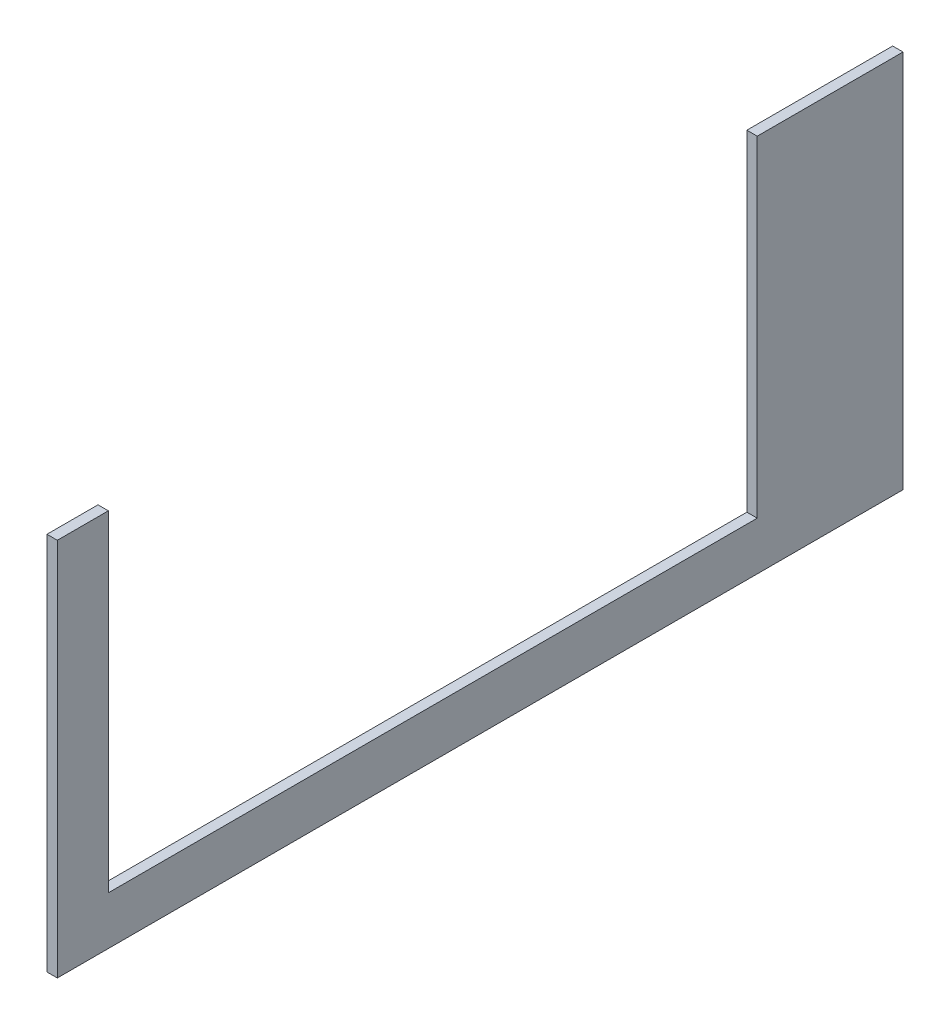
ISO-10303-21;
HEADER;
FILE_DESCRIPTION(('STEP AP214'),'2;1');
FILE_NAME('part.step','',(''),(''),'','','');
FILE_SCHEMA(('AUTOMOTIVE_DESIGN { 1 0 10303 214 1 1 1 1 }'));
ENDSEC;
DATA;
#1=APPLICATION_CONTEXT('core data for automotive mechanical design processes');
#2=APPLICATION_PROTOCOL_DEFINITION('international standard','automotive_design',2000,#1);
#3=PRODUCT_CONTEXT('',#1,'mechanical');
#4=PRODUCT('Part','Part','',(#3));
#5=PRODUCT_RELATED_PRODUCT_CATEGORY('part','',(#4));
#6=PRODUCT_DEFINITION_FORMATION('','',#4);
#7=PRODUCT_DEFINITION_CONTEXT('part definition',#1,'design');
#8=PRODUCT_DEFINITION('design','',#6,#7);
#9=PRODUCT_DEFINITION_SHAPE('','',#8);
#10=(LENGTH_UNIT() NAMED_UNIT(*) SI_UNIT(.MILLI.,.METRE.));
#11=(NAMED_UNIT(*) PLANE_ANGLE_UNIT() SI_UNIT($,.RADIAN.));
#12=(NAMED_UNIT(*) SI_UNIT($,.STERADIAN.) SOLID_ANGLE_UNIT());
#13=UNCERTAINTY_MEASURE_WITH_UNIT(LENGTH_MEASURE(1.E-05),#10,'distance_accuracy_value','');
#14=(GEOMETRIC_REPRESENTATION_CONTEXT(3) GLOBAL_UNCERTAINTY_ASSIGNED_CONTEXT((#13)) GLOBAL_UNIT_ASSIGNED_CONTEXT((#10,
#11,#12)) REPRESENTATION_CONTEXT('',''));
#15=CARTESIAN_POINT('',(0.,0.,0.));
#16=DIRECTION('',(0.,0.,1.));
#17=DIRECTION('',(1.,0.,0.));
#18=AXIS2_PLACEMENT_3D('',#15,#16,#17);
#19=CARTESIAN_POINT('',(3.556,260.,-35.));
#20=DIRECTION('',(0.,0.,1.));
#21=DIRECTION('',(1.,0.,0.));
#22=AXIS2_PLACEMENT_3D('',#19,#20,#21);
#23=PLANE('',#22);
#24=DIRECTION('',(0.,1.,0.));
#25=VECTOR('',#24,1.);
#26=CARTESIAN_POINT('',(-3.556,260.,-35.));
#27=LINE('',#26,#25);
#28=CARTESIAN_POINT('',(-3.556,33.112,-35.));
#29=VERTEX_POINT('',#28);
#30=CARTESIAN_POINT('',(-3.556,260.,-35.));
#31=VERTEX_POINT('',#30);
#32=EDGE_CURVE('E133',#29,#31,#27,.T.);
#33=ORIENTED_EDGE('',*,*,#32,.T.);
#34=DIRECTION('',(-1.,0.,0.));
#35=VECTOR('',#34,1.);
#36=CARTESIAN_POINT('',(3.556,260.,-35.));
#37=LINE('',#36,#35);
#38=CARTESIAN_POINT('',(3.556,260.,-35.));
#39=VERTEX_POINT('',#38);
#40=EDGE_CURVE('E11',#39,#31,#37,.T.);
#41=ORIENTED_EDGE('',*,*,#40,.F.);
#42=DIRECTION('',(0.,1.,0.));
#43=VECTOR('',#42,1.);
#44=CARTESIAN_POINT('',(3.556,260.,-35.));
#45=LINE('',#44,#43);
#46=CARTESIAN_POINT('',(3.556,33.112,-35.));
#47=VERTEX_POINT('',#46);
#48=EDGE_CURVE('E147',#47,#39,#45,.T.);
#49=ORIENTED_EDGE('',*,*,#48,.F.);
#50=DIRECTION('',(-1.,0.,0.));
#51=VECTOR('',#50,1.);
#52=CARTESIAN_POINT('',(3.556,33.112,-35.));
#53=LINE('',#52,#51);
#54=EDGE_CURVE('E129',#47,#29,#53,.T.);
#55=ORIENTED_EDGE('',*,*,#54,.T.);
#56=EDGE_LOOP('',(#33,#41,#49,#55));
#57=FACE_BOUND('',#56,.T.);
#58=ADVANCED_FACE('F37',(#57),#23,.F.);
#59=CARTESIAN_POINT('',(3.556,260.,0.));
#60=DIRECTION('',(0.,-1.,0.));
#61=DIRECTION('',(0.,0.,-1.));
#62=AXIS2_PLACEMENT_3D('',#59,#60,#61);
#63=PLANE('',#62);
#64=DIRECTION('',(0.,0.,1.));
#65=VECTOR('',#64,1.);
#66=CARTESIAN_POINT('',(-3.556,260.,0.));
#67=LINE('',#66,#65);
#68=CARTESIAN_POINT('',(-3.556,260.,0.));
#69=VERTEX_POINT('',#68);
#70=EDGE_CURVE('E136',#31,#69,#67,.T.);
#71=ORIENTED_EDGE('',*,*,#70,.T.);
#72=DIRECTION('',(-1.,0.,0.));
#73=VECTOR('',#72,1.);
#74=CARTESIAN_POINT('',(3.556,260.,0.));
#75=LINE('',#74,#73);
#76=CARTESIAN_POINT('',(3.556,260.,0.));
#77=VERTEX_POINT('',#76);
#78=EDGE_CURVE('E45',#77,#69,#75,.T.);
#79=ORIENTED_EDGE('',*,*,#78,.F.);
#80=DIRECTION('',(0.,0.,1.));
#81=VECTOR('',#80,1.);
#82=CARTESIAN_POINT('',(3.556,260.,0.));
#83=LINE('',#82,#81);
#84=EDGE_CURVE('E96',#39,#77,#83,.T.);
#85=ORIENTED_EDGE('',*,*,#84,.F.);
#86=ORIENTED_EDGE('',*,*,#40,.T.);
#87=EDGE_LOOP('',(#71,#79,#85,#86));
#88=FACE_BOUND('',#87,.T.);
#89=ADVANCED_FACE('F182',(#88),#63,.F.);
#90=CARTESIAN_POINT('',(3.556,260.,0.));
#91=DIRECTION('',(0.,0.,-1.));
#92=DIRECTION('',(-1.,0.,0.));
#93=AXIS2_PLACEMENT_3D('',#90,#91,#92);
#94=PLANE('',#93);
#95=DIRECTION('',(0.,-1.,0.));
#96=VECTOR('',#95,1.);
#97=CARTESIAN_POINT('',(-3.556,260.,0.));
#98=LINE('',#97,#96);
#99=CARTESIAN_POINT('',(-3.556,0.,0.));
#100=VERTEX_POINT('',#99);
#101=EDGE_CURVE('E138',#69,#100,#98,.T.);
#102=ORIENTED_EDGE('',*,*,#101,.T.);
#103=DIRECTION('',(-1.,0.,0.));
#104=VECTOR('',#103,1.);
#105=CARTESIAN_POINT('',(3.556,0.,0.));
#106=LINE('',#105,#104);
#107=CARTESIAN_POINT('',(3.556,0.,0.));
#108=VERTEX_POINT('',#107);
#109=EDGE_CURVE('E154',#108,#100,#106,.T.);
#110=ORIENTED_EDGE('',*,*,#109,.F.);
#111=DIRECTION('',(0.,-1.,0.));
#112=VECTOR('',#111,1.);
#113=CARTESIAN_POINT('',(3.556,260.,0.));
#114=LINE('',#113,#112);
#115=EDGE_CURVE('E162',#77,#108,#114,.T.);
#116=ORIENTED_EDGE('',*,*,#115,.F.);
#117=ORIENTED_EDGE('',*,*,#78,.T.);
#118=EDGE_LOOP('',(#102,#110,#116,#117));
#119=FACE_BOUND('',#118,.T.);
#120=ADVANCED_FACE('F160',(#119),#94,.F.);
#121=CARTESIAN_POINT('',(3.556,0.,0.));
#122=DIRECTION('',(0.,1.,0.));
#123=DIRECTION('',(0.,0.,1.));
#124=AXIS2_PLACEMENT_3D('',#121,#122,#123);
#125=PLANE('',#124);
#126=DIRECTION('',(0.,0.,-1.));
#127=VECTOR('',#126,1.);
#128=CARTESIAN_POINT('',(-3.556,0.,0.));
#129=LINE('',#128,#127);
#130=CARTESIAN_POINT('',(-3.556,0.,-580.));
#131=VERTEX_POINT('',#130);
#132=EDGE_CURVE('E140',#100,#131,#129,.T.);
#133=ORIENTED_EDGE('',*,*,#132,.T.);
#134=DIRECTION('',(-1.,0.,0.));
#135=VECTOR('',#134,1.);
#136=CARTESIAN_POINT('',(3.556,0.,-580.));
#137=LINE('',#136,#135);
#138=CARTESIAN_POINT('',(3.556,0.,-580.));
#139=VERTEX_POINT('',#138);
#140=EDGE_CURVE('E151',#139,#131,#137,.T.);
#141=ORIENTED_EDGE('',*,*,#140,.F.);
#142=DIRECTION('',(0.,0.,-1.));
#143=VECTOR('',#142,1.);
#144=CARTESIAN_POINT('',(3.556,0.,0.));
#145=LINE('',#144,#143);
#146=EDGE_CURVE('E174',#108,#139,#145,.T.);
#147=ORIENTED_EDGE('',*,*,#146,.F.);
#148=ORIENTED_EDGE('',*,*,#109,.T.);
#149=EDGE_LOOP('',(#133,#141,#147,#148));
#150=FACE_BOUND('',#149,.T.);
#151=ADVANCED_FACE('F170',(#150),#125,.F.);
#152=CARTESIAN_POINT('',(3.556,260.,-580.));
#153=DIRECTION('',(0.,0.,1.));
#154=DIRECTION('',(1.,0.,0.));
#155=AXIS2_PLACEMENT_3D('',#152,#153,#154);
#156=PLANE('',#155);
#157=DIRECTION('',(0.,1.,0.));
#158=VECTOR('',#157,1.);
#159=CARTESIAN_POINT('',(-3.556,260.,-580.));
#160=LINE('',#159,#158);
#161=CARTESIAN_POINT('',(-3.556,260.,-580.));
#162=VERTEX_POINT('',#161);
#163=EDGE_CURVE('E142',#131,#162,#160,.T.);
#164=ORIENTED_EDGE('',*,*,#163,.T.);
#165=DIRECTION('',(-1.,0.,0.));
#166=VECTOR('',#165,1.);
#167=CARTESIAN_POINT('',(3.556,260.,-580.));
#168=LINE('',#167,#166);
#169=CARTESIAN_POINT('',(3.556,260.,-580.));
#170=VERTEX_POINT('',#169);
#171=EDGE_CURVE('E124',#170,#162,#168,.T.);
#172=ORIENTED_EDGE('',*,*,#171,.F.);
#173=DIRECTION('',(0.,1.,0.));
#174=VECTOR('',#173,1.);
#175=CARTESIAN_POINT('',(3.556,260.,-580.));
#176=LINE('',#175,#174);
#177=EDGE_CURVE('E115',#139,#170,#176,.T.);
#178=ORIENTED_EDGE('',*,*,#177,.F.);
#179=ORIENTED_EDGE('',*,*,#140,.T.);
#180=EDGE_LOOP('',(#164,#172,#178,#179));
#181=FACE_BOUND('',#180,.T.);
#182=ADVANCED_FACE('F173',(#181),#156,.F.);
#183=CARTESIAN_POINT('',(3.556,260.,-480.));
#184=DIRECTION('',(0.,-1.,0.));
#185=DIRECTION('',(0.,0.,-1.));
#186=AXIS2_PLACEMENT_3D('',#183,#184,#185);
#187=PLANE('',#186);
#188=DIRECTION('',(0.,0.,1.));
#189=VECTOR('',#188,1.);
#190=CARTESIAN_POINT('',(-3.556,260.,-480.));
#191=LINE('',#190,#189);
#192=CARTESIAN_POINT('',(-3.556,260.,-480.));
#193=VERTEX_POINT('',#192);
#194=EDGE_CURVE('E123',#162,#193,#191,.T.);
#195=ORIENTED_EDGE('',*,*,#194,.T.);
#196=DIRECTION('',(-1.,0.,0.));
#197=VECTOR('',#196,1.);
#198=CARTESIAN_POINT('',(3.556,260.,-480.));
#199=LINE('',#198,#197);
#200=CARTESIAN_POINT('',(3.556,260.,-480.));
#201=VERTEX_POINT('',#200);
#202=EDGE_CURVE('E120',#201,#193,#199,.T.);
#203=ORIENTED_EDGE('',*,*,#202,.F.);
#204=DIRECTION('',(0.,0.,1.));
#205=VECTOR('',#204,1.);
#206=CARTESIAN_POINT('',(3.556,260.,-480.));
#207=LINE('',#206,#205);
#208=EDGE_CURVE('E109',#170,#201,#207,.T.);
#209=ORIENTED_EDGE('',*,*,#208,.F.);
#210=ORIENTED_EDGE('',*,*,#171,.T.);
#211=EDGE_LOOP('',(#195,#203,#209,#210));
#212=FACE_BOUND('',#211,.T.);
#213=ADVANCED_FACE('F121',(#212),#187,.F.);
#214=CARTESIAN_POINT('',(3.556,260.,-480.));
#215=DIRECTION('',(0.,0.,-1.));
#216=DIRECTION('',(-1.,0.,0.));
#217=AXIS2_PLACEMENT_3D('',#214,#215,#216);
#218=PLANE('',#217);
#219=DIRECTION('',(0.,-1.,0.));
#220=VECTOR('',#219,1.);
#221=CARTESIAN_POINT('',(-3.556,260.,-480.));
#222=LINE('',#221,#220);
#223=CARTESIAN_POINT('',(-3.556,33.1120000000001,-480.));
#224=VERTEX_POINT('',#223);
#225=EDGE_CURVE('E82',#193,#224,#222,.T.);
#226=ORIENTED_EDGE('',*,*,#225,.T.);
#227=DIRECTION('',(-1.,0.,0.));
#228=VECTOR('',#227,1.);
#229=CARTESIAN_POINT('',(3.556,33.1120000000001,-480.));
#230=LINE('',#229,#228);
#231=CARTESIAN_POINT('',(3.556,33.1120000000001,-480.));
#232=VERTEX_POINT('',#231);
#233=EDGE_CURVE('E125',#232,#224,#230,.T.);
#234=ORIENTED_EDGE('',*,*,#233,.F.);
#235=DIRECTION('',(0.,-1.,0.));
#236=VECTOR('',#235,1.);
#237=CARTESIAN_POINT('',(3.556,260.,-480.));
#238=LINE('',#237,#236);
#239=EDGE_CURVE('E113',#201,#232,#238,.T.);
#240=ORIENTED_EDGE('',*,*,#239,.F.);
#241=ORIENTED_EDGE('',*,*,#202,.T.);
#242=EDGE_LOOP('',(#226,#234,#240,#241));
#243=FACE_BOUND('',#242,.T.);
#244=ADVANCED_FACE('F127',(#243),#218,.F.);
#245=CARTESIAN_POINT('',(3.556,33.112,-35.));
#246=DIRECTION('',(0.,-1.,0.));
#247=DIRECTION('',(0.,0.,-1.));
#248=AXIS2_PLACEMENT_3D('',#245,#246,#247);
#249=PLANE('',#248);
#250=DIRECTION('',(0.,0.,1.));
#251=VECTOR('',#250,1.);
#252=CARTESIAN_POINT('',(-3.556,33.112,-35.));
#253=LINE('',#252,#251);
#254=EDGE_CURVE('E88',#224,#29,#253,.T.);
#255=ORIENTED_EDGE('',*,*,#254,.T.);
#256=ORIENTED_EDGE('',*,*,#54,.F.);
#257=DIRECTION('',(0.,0.,1.));
#258=VECTOR('',#257,1.);
#259=CARTESIAN_POINT('',(3.556,33.112,-35.));
#260=LINE('',#259,#258);
#261=EDGE_CURVE('E53',#232,#47,#260,.T.);
#262=ORIENTED_EDGE('',*,*,#261,.F.);
#263=ORIENTED_EDGE('',*,*,#233,.T.);
#264=EDGE_LOOP('',(#255,#256,#262,#263));
#265=FACE_BOUND('',#264,.T.);
#266=ADVANCED_FACE('F198',(#265),#249,.F.);
#267=CARTESIAN_POINT('',(3.556,0.,0.));
#268=DIRECTION('',(1.,0.,0.));
#269=DIRECTION('',(0.,0.,-1.));
#270=AXIS2_PLACEMENT_3D('',#267,#268,#269);
#271=PLANE('',#270);
#272=ORIENTED_EDGE('',*,*,#48,.T.);
#273=ORIENTED_EDGE('',*,*,#84,.T.);
#274=ORIENTED_EDGE('',*,*,#115,.T.);
#275=ORIENTED_EDGE('',*,*,#146,.T.);
#276=ORIENTED_EDGE('',*,*,#177,.T.);
#277=ORIENTED_EDGE('',*,*,#208,.T.);
#278=ORIENTED_EDGE('',*,*,#239,.T.);
#279=ORIENTED_EDGE('',*,*,#261,.T.);
#280=EDGE_LOOP('',(#272,#273,#274,#275,#276,#277,#278,#279));
#281=FACE_BOUND('',#280,.T.);
#282=ADVANCED_FACE('F111',(#281),#271,.T.);
#283=CARTESIAN_POINT('',(-3.556,0.,0.));
#284=DIRECTION('',(1.,0.,0.));
#285=DIRECTION('',(0.,0.,-1.));
#286=AXIS2_PLACEMENT_3D('',#283,#284,#285);
#287=PLANE('',#286);
#288=ORIENTED_EDGE('',*,*,#32,.F.);
#289=ORIENTED_EDGE('',*,*,#254,.F.);
#290=ORIENTED_EDGE('',*,*,#225,.F.);
#291=ORIENTED_EDGE('',*,*,#194,.F.);
#292=ORIENTED_EDGE('',*,*,#163,.F.);
#293=ORIENTED_EDGE('',*,*,#132,.F.);
#294=ORIENTED_EDGE('',*,*,#101,.F.);
#295=ORIENTED_EDGE('',*,*,#70,.F.);
#296=EDGE_LOOP('',(#288,#289,#290,#291,#292,#293,#294,#295));
#297=FACE_BOUND('',#296,.T.);
#298=ADVANCED_FACE('F166',(#297),#287,.F.);
#299=CLOSED_SHELL('',(#58,#89,#120,#151,#182,#213,#244,#266,#282,#298));
#300=MANIFOLD_SOLID_BREP('B2',#299);
#301=ADVANCED_BREP_SHAPE_REPRESENTATION('',(#18,#300),#14);
#302=SHAPE_DEFINITION_REPRESENTATION(#9,#301);
ENDSEC;
END-ISO-10303-21;
